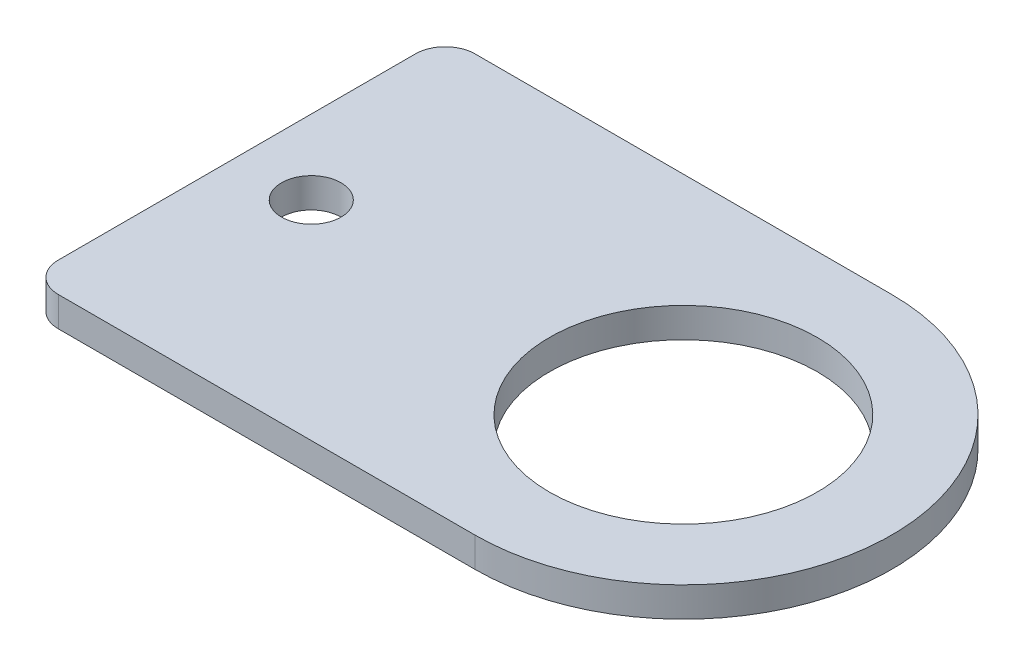
ISO-10303-21;
HEADER;
FILE_DESCRIPTION(('STEP AP214'),'2;1');
FILE_NAME('part.step','',(''),(''),'','','');
FILE_SCHEMA(('AUTOMOTIVE_DESIGN { 1 0 10303 214 1 1 1 1 }'));
ENDSEC;
DATA;
#1=APPLICATION_CONTEXT('core data for automotive mechanical design processes');
#2=APPLICATION_PROTOCOL_DEFINITION('international standard','automotive_design',2000,#1);
#3=PRODUCT_CONTEXT('',#1,'mechanical');
#4=PRODUCT('Part','Part','',(#3));
#5=PRODUCT_RELATED_PRODUCT_CATEGORY('part','',(#4));
#6=PRODUCT_DEFINITION_FORMATION('','',#4);
#7=PRODUCT_DEFINITION_CONTEXT('part definition',#1,'design');
#8=PRODUCT_DEFINITION('design','',#6,#7);
#9=PRODUCT_DEFINITION_SHAPE('','',#8);
#10=(LENGTH_UNIT() NAMED_UNIT(*) SI_UNIT(.MILLI.,.METRE.));
#11=(NAMED_UNIT(*) PLANE_ANGLE_UNIT() SI_UNIT($,.RADIAN.));
#12=(NAMED_UNIT(*) SI_UNIT($,.STERADIAN.) SOLID_ANGLE_UNIT());
#13=UNCERTAINTY_MEASURE_WITH_UNIT(LENGTH_MEASURE(1.E-05),#10,'distance_accuracy_value','');
#14=(GEOMETRIC_REPRESENTATION_CONTEXT(3) GLOBAL_UNCERTAINTY_ASSIGNED_CONTEXT((#13)) GLOBAL_UNIT_ASSIGNED_CONTEXT((#10,
#11,#12)) REPRESENTATION_CONTEXT('',''));
#15=CARTESIAN_POINT('',(0.,0.,0.));
#16=DIRECTION('',(0.,0.,1.));
#17=DIRECTION('',(1.,0.,0.));
#18=AXIS2_PLACEMENT_3D('',#15,#16,#17);
#19=CARTESIAN_POINT('',(15.,2.,0.));
#20=DIRECTION('',(0.,-1.,0.));
#21=DIRECTION('',(0.,0.,-1.));
#22=AXIS2_PLACEMENT_3D('',#19,#20,#21);
#23=PLANE('',#22);
#24=DIRECTION('',(-1.,0.,0.));
#25=VECTOR('',#24,1.);
#26=CARTESIAN_POINT('',(-15.,2.,-14.));
#27=LINE('',#26,#25);
#28=CARTESIAN_POINT('',(15.,2.,-14.));
#29=VERTEX_POINT('',#28);
#30=CARTESIAN_POINT('',(-13.,2.,-14.));
#31=VERTEX_POINT('',#30);
#32=EDGE_CURVE('E93',#29,#31,#27,.T.);
#33=ORIENTED_EDGE('',*,*,#32,.T.);
#34=CARTESIAN_POINT('',(-13.,2.,-12.));
#35=DIRECTION('',(0.,-1.,0.));
#36=DIRECTION('',(0.,0.,-1.));
#37=AXIS2_PLACEMENT_3D('',#34,#35,#36);
#38=CIRCLE('',#37,2.);
#39=CARTESIAN_POINT('',(-15.,2.,-12.));
#40=VERTEX_POINT('',#39);
#41=EDGE_CURVE('E48',#31,#40,#38,.F.);
#42=ORIENTED_EDGE('',*,*,#41,.T.);
#43=DIRECTION('',(0.,0.,1.));
#44=VECTOR('',#43,1.);
#45=CARTESIAN_POINT('',(-15.,2.,14.));
#46=LINE('',#45,#44);
#47=CARTESIAN_POINT('',(-15.,2.,12.));
#48=VERTEX_POINT('',#47);
#49=EDGE_CURVE('E101',#40,#48,#46,.T.);
#50=ORIENTED_EDGE('',*,*,#49,.T.);
#51=CARTESIAN_POINT('',(-13.,2.,12.));
#52=DIRECTION('',(0.,-1.,0.));
#53=DIRECTION('',(0.,0.,-1.));
#54=AXIS2_PLACEMENT_3D('',#51,#52,#53);
#55=CIRCLE('',#54,2.);
#56=CARTESIAN_POINT('',(-13.,2.,14.));
#57=VERTEX_POINT('',#56);
#58=EDGE_CURVE('E55',#48,#57,#55,.F.);
#59=ORIENTED_EDGE('',*,*,#58,.T.);
#60=DIRECTION('',(1.,0.,0.));
#61=VECTOR('',#60,1.);
#62=CARTESIAN_POINT('',(-15.,2.,14.));
#63=LINE('',#62,#61);
#64=CARTESIAN_POINT('',(15.,2.,14.));
#65=VERTEX_POINT('',#64);
#66=EDGE_CURVE('E106',#57,#65,#63,.T.);
#67=ORIENTED_EDGE('',*,*,#66,.T.);
#68=CARTESIAN_POINT('',(15.,2.,0.));
#69=DIRECTION('',(0.,1.,0.));
#70=DIRECTION('',(0.,0.,-1.));
#71=AXIS2_PLACEMENT_3D('',#68,#69,#70);
#72=CIRCLE('',#71,14.);
#73=EDGE_CURVE('E102',#65,#29,#72,.T.);
#74=ORIENTED_EDGE('',*,*,#73,.T.);
#75=EDGE_LOOP('',(#33,#42,#50,#59,#67,#74));
#76=FACE_BOUND('',#75,.T.);
#77=CARTESIAN_POINT('',(-10.,2.,0.));
#78=DIRECTION('',(0.,1.,0.));
#79=DIRECTION('',(0.,0.,1.));
#80=AXIS2_PLACEMENT_3D('',#77,#78,#79);
#81=CIRCLE('',#80,2.);
#82=CARTESIAN_POINT('',(-10.,2.,2.));
#83=VERTEX_POINT('',#82);
#84=EDGE_CURVE('E161',#83,#83,#81,.T.);
#85=ORIENTED_EDGE('',*,*,#84,.F.);
#86=EDGE_LOOP('',(#85));
#87=FACE_BOUND('',#86,.T.);
#88=CARTESIAN_POINT('',(15.,2.,0.));
#89=DIRECTION('',(0.,1.,0.));
#90=DIRECTION('',(0.,0.,1.));
#91=AXIS2_PLACEMENT_3D('',#88,#89,#90);
#92=CIRCLE('',#91,9.);
#93=CARTESIAN_POINT('',(15.,2.,9.));
#94=VERTEX_POINT('',#93);
#95=EDGE_CURVE('E256',#94,#94,#92,.T.);
#96=ORIENTED_EDGE('',*,*,#95,.F.);
#97=EDGE_LOOP('',(#96));
#98=FACE_BOUND('',#97,.T.);
#99=ADVANCED_FACE('F39',(#76,#87,#98),#23,.F.);
#100=CARTESIAN_POINT('',(15.,0.,0.));
#101=DIRECTION('',(0.,-1.,0.));
#102=DIRECTION('',(0.,0.,-1.));
#103=AXIS2_PLACEMENT_3D('',#100,#101,#102);
#104=PLANE('',#103);
#105=CARTESIAN_POINT('',(-10.,0.,0.));
#106=DIRECTION('',(0.,1.,0.));
#107=DIRECTION('',(0.,0.,1.));
#108=AXIS2_PLACEMENT_3D('',#105,#106,#107);
#109=CIRCLE('',#108,2.);
#110=CARTESIAN_POINT('',(-10.,0.,2.));
#111=VERTEX_POINT('',#110);
#112=EDGE_CURVE('E263',#111,#111,#109,.T.);
#113=ORIENTED_EDGE('',*,*,#112,.T.);
#114=EDGE_LOOP('',(#113));
#115=FACE_BOUND('',#114,.T.);
#116=DIRECTION('',(0.,0.,1.));
#117=VECTOR('',#116,1.);
#118=CARTESIAN_POINT('',(-15.,0.,14.));
#119=LINE('',#118,#117);
#120=CARTESIAN_POINT('',(-15.,0.,-12.));
#121=VERTEX_POINT('',#120);
#122=CARTESIAN_POINT('',(-15.,0.,12.));
#123=VERTEX_POINT('',#122);
#124=EDGE_CURVE('E155',#121,#123,#119,.T.);
#125=ORIENTED_EDGE('',*,*,#124,.F.);
#126=CARTESIAN_POINT('',(-13.,0.,-12.));
#127=DIRECTION('',(0.,-1.,0.));
#128=DIRECTION('',(0.,0.,-1.));
#129=AXIS2_PLACEMENT_3D('',#126,#127,#128);
#130=CIRCLE('',#129,2.);
#131=CARTESIAN_POINT('',(-13.,0.,-14.));
#132=VERTEX_POINT('',#131);
#133=EDGE_CURVE('E133',#121,#132,#130,.T.);
#134=ORIENTED_EDGE('',*,*,#133,.T.);
#135=DIRECTION('',(-1.,0.,0.));
#136=VECTOR('',#135,1.);
#137=CARTESIAN_POINT('',(-15.,0.,-14.));
#138=LINE('',#137,#136);
#139=CARTESIAN_POINT('',(15.,0.,-14.));
#140=VERTEX_POINT('',#139);
#141=EDGE_CURVE('E154',#140,#132,#138,.T.);
#142=ORIENTED_EDGE('',*,*,#141,.F.);
#143=CARTESIAN_POINT('',(15.,0.,0.));
#144=DIRECTION('',(0.,1.,0.));
#145=DIRECTION('',(0.,0.,-1.));
#146=AXIS2_PLACEMENT_3D('',#143,#144,#145);
#147=CIRCLE('',#146,14.);
#148=CARTESIAN_POINT('',(15.,0.,14.));
#149=VERTEX_POINT('',#148);
#150=EDGE_CURVE('E115',#149,#140,#147,.T.);
#151=ORIENTED_EDGE('',*,*,#150,.F.);
#152=DIRECTION('',(1.,0.,0.));
#153=VECTOR('',#152,1.);
#154=CARTESIAN_POINT('',(-15.,0.,14.));
#155=LINE('',#154,#153);
#156=CARTESIAN_POINT('',(-13.,0.,14.));
#157=VERTEX_POINT('',#156);
#158=EDGE_CURVE('E111',#157,#149,#155,.T.);
#159=ORIENTED_EDGE('',*,*,#158,.F.);
#160=CARTESIAN_POINT('',(-13.,0.,12.));
#161=DIRECTION('',(0.,-1.,0.));
#162=DIRECTION('',(0.,0.,-1.));
#163=AXIS2_PLACEMENT_3D('',#160,#161,#162);
#164=CIRCLE('',#163,2.);
#165=EDGE_CURVE('E130',#157,#123,#164,.T.);
#166=ORIENTED_EDGE('',*,*,#165,.T.);
#167=EDGE_LOOP('',(#125,#134,#142,#151,#159,#166));
#168=FACE_BOUND('',#167,.T.);
#169=CARTESIAN_POINT('',(15.,0.,0.));
#170=DIRECTION('',(0.,1.,0.));
#171=DIRECTION('',(0.,0.,1.));
#172=AXIS2_PLACEMENT_3D('',#169,#170,#171);
#173=CIRCLE('',#172,9.);
#174=CARTESIAN_POINT('',(15.,0.,9.));
#175=VERTEX_POINT('',#174);
#176=EDGE_CURVE('E259',#175,#175,#173,.T.);
#177=ORIENTED_EDGE('',*,*,#176,.T.);
#178=EDGE_LOOP('',(#177));
#179=FACE_BOUND('',#178,.T.);
#180=ADVANCED_FACE('F152',(#115,#168,#179),#104,.T.);
#181=CARTESIAN_POINT('',(15.,2.,0.));
#182=DIRECTION('',(0.,-1.,0.));
#183=DIRECTION('',(0.,0.,-1.));
#184=AXIS2_PLACEMENT_3D('',#181,#182,#183);
#185=CYLINDRICAL_SURFACE('',#184,14.);
#186=ORIENTED_EDGE('',*,*,#150,.T.);
#187=DIRECTION('',(0.,-1.,0.));
#188=VECTOR('',#187,1.);
#189=CARTESIAN_POINT('',(15.,2.,-14.));
#190=LINE('',#189,#188);
#191=EDGE_CURVE('E97',#29,#140,#190,.T.);
#192=ORIENTED_EDGE('',*,*,#191,.F.);
#193=ORIENTED_EDGE('',*,*,#73,.F.);
#194=DIRECTION('',(0.,-1.,0.));
#195=VECTOR('',#194,1.);
#196=CARTESIAN_POINT('',(15.,2.,14.));
#197=LINE('',#196,#195);
#198=EDGE_CURVE('E118',#65,#149,#197,.T.);
#199=ORIENTED_EDGE('',*,*,#198,.T.);
#200=EDGE_LOOP('',(#186,#192,#193,#199));
#201=FACE_BOUND('',#200,.T.);
#202=ADVANCED_FACE('F113',(#201),#185,.T.);
#203=CARTESIAN_POINT('',(-15.,2.,-14.));
#204=DIRECTION('',(0.,0.,1.));
#205=DIRECTION('',(1.,0.,0.));
#206=AXIS2_PLACEMENT_3D('',#203,#204,#205);
#207=PLANE('',#206);
#208=ORIENTED_EDGE('',*,*,#141,.T.);
#209=DIRECTION('',(0.,-1.,0.));
#210=VECTOR('',#209,1.);
#211=CARTESIAN_POINT('',(-13.,2.,-14.));
#212=LINE('',#211,#210);
#213=EDGE_CURVE('E63',#132,#31,#212,.F.);
#214=ORIENTED_EDGE('',*,*,#213,.T.);
#215=ORIENTED_EDGE('',*,*,#32,.F.);
#216=ORIENTED_EDGE('',*,*,#191,.T.);
#217=EDGE_LOOP('',(#208,#214,#215,#216));
#218=FACE_BOUND('',#217,.T.);
#219=ADVANCED_FACE('F95',(#218),#207,.F.);
#220=CARTESIAN_POINT('',(-15.,2.,14.));
#221=DIRECTION('',(1.,0.,0.));
#222=DIRECTION('',(0.,0.,-1.));
#223=AXIS2_PLACEMENT_3D('',#220,#221,#222);
#224=PLANE('',#223);
#225=ORIENTED_EDGE('',*,*,#49,.F.);
#226=DIRECTION('',(0.,-1.,0.));
#227=VECTOR('',#226,1.);
#228=CARTESIAN_POINT('',(-15.,2.,-12.));
#229=LINE('',#228,#227);
#230=EDGE_CURVE('E122',#40,#121,#229,.T.);
#231=ORIENTED_EDGE('',*,*,#230,.T.);
#232=ORIENTED_EDGE('',*,*,#124,.T.);
#233=DIRECTION('',(0.,-1.,0.));
#234=VECTOR('',#233,1.);
#235=CARTESIAN_POINT('',(-15.,2.,12.));
#236=LINE('',#235,#234);
#237=EDGE_CURVE('E117',#123,#48,#236,.F.);
#238=ORIENTED_EDGE('',*,*,#237,.T.);
#239=EDGE_LOOP('',(#225,#231,#232,#238));
#240=FACE_BOUND('',#239,.T.);
#241=ADVANCED_FACE('F144',(#240),#224,.F.);
#242=CARTESIAN_POINT('',(-15.,2.,14.));
#243=DIRECTION('',(0.,0.,-1.));
#244=DIRECTION('',(-1.,0.,0.));
#245=AXIS2_PLACEMENT_3D('',#242,#243,#244);
#246=PLANE('',#245);
#247=ORIENTED_EDGE('',*,*,#66,.F.);
#248=DIRECTION('',(0.,-1.,0.));
#249=VECTOR('',#248,1.);
#250=CARTESIAN_POINT('',(-13.,2.,14.));
#251=LINE('',#250,#249);
#252=EDGE_CURVE('E11',#57,#157,#251,.T.);
#253=ORIENTED_EDGE('',*,*,#252,.T.);
#254=ORIENTED_EDGE('',*,*,#158,.T.);
#255=ORIENTED_EDGE('',*,*,#198,.F.);
#256=EDGE_LOOP('',(#247,#253,#254,#255));
#257=FACE_BOUND('',#256,.T.);
#258=ADVANCED_FACE('F167',(#257),#246,.F.);
#259=CARTESIAN_POINT('',(-10.,2.,0.));
#260=DIRECTION('',(0.,-1.,0.));
#261=DIRECTION('',(0.,0.,-1.));
#262=AXIS2_PLACEMENT_3D('',#259,#260,#261);
#263=CYLINDRICAL_SURFACE('',#262,2.);
#264=ORIENTED_EDGE('',*,*,#84,.T.);
#265=EDGE_LOOP('',(#264));
#266=FACE_BOUND('',#265,.T.);
#267=ORIENTED_EDGE('',*,*,#112,.F.);
#268=EDGE_LOOP('',(#267));
#269=FACE_BOUND('',#268,.T.);
#270=ADVANCED_FACE('F183',(#266,#269),#263,.F.);
#271=CARTESIAN_POINT('',(15.,2.,0.));
#272=DIRECTION('',(0.,-1.,0.));
#273=DIRECTION('',(0.,0.,-1.));
#274=AXIS2_PLACEMENT_3D('',#271,#272,#273);
#275=CYLINDRICAL_SURFACE('',#274,9.);
#276=ORIENTED_EDGE('',*,*,#95,.T.);
#277=EDGE_LOOP('',(#276));
#278=FACE_BOUND('',#277,.T.);
#279=ORIENTED_EDGE('',*,*,#176,.F.);
#280=EDGE_LOOP('',(#279));
#281=FACE_BOUND('',#280,.T.);
#282=ADVANCED_FACE('F174',(#278,#281),#275,.F.);
#283=CARTESIAN_POINT('',(-13.,2.,-12.));
#284=DIRECTION('',(0.,-1.,0.));
#285=DIRECTION('',(0.,0.,-1.));
#286=AXIS2_PLACEMENT_3D('',#283,#284,#285);
#287=CYLINDRICAL_SURFACE('',#286,2.);
#288=ORIENTED_EDGE('',*,*,#41,.F.);
#289=ORIENTED_EDGE('',*,*,#213,.F.);
#290=ORIENTED_EDGE('',*,*,#133,.F.);
#291=ORIENTED_EDGE('',*,*,#230,.F.);
#292=EDGE_LOOP('',(#288,#289,#290,#291));
#293=FACE_BOUND('',#292,.T.);
#294=ADVANCED_FACE('F150',(#293),#287,.T.);
#295=CARTESIAN_POINT('',(-13.,2.,12.));
#296=DIRECTION('',(0.,-1.,0.));
#297=DIRECTION('',(0.,0.,-1.));
#298=AXIS2_PLACEMENT_3D('',#295,#296,#297);
#299=CYLINDRICAL_SURFACE('',#298,2.);
#300=ORIENTED_EDGE('',*,*,#58,.F.);
#301=ORIENTED_EDGE('',*,*,#237,.F.);
#302=ORIENTED_EDGE('',*,*,#165,.F.);
#303=ORIENTED_EDGE('',*,*,#252,.F.);
#304=EDGE_LOOP('',(#300,#301,#302,#303));
#305=FACE_BOUND('',#304,.T.);
#306=ADVANCED_FACE('F41',(#305),#299,.T.);
#307=CLOSED_SHELL('',(#99,#180,#202,#219,#241,#258,#270,#282,#294,#306));
#308=MANIFOLD_SOLID_BREP('B2',#307);
#309=ADVANCED_BREP_SHAPE_REPRESENTATION('',(#18,#308),#14);
#310=SHAPE_DEFINITION_REPRESENTATION(#9,#309);
ENDSEC;
END-ISO-10303-21;
